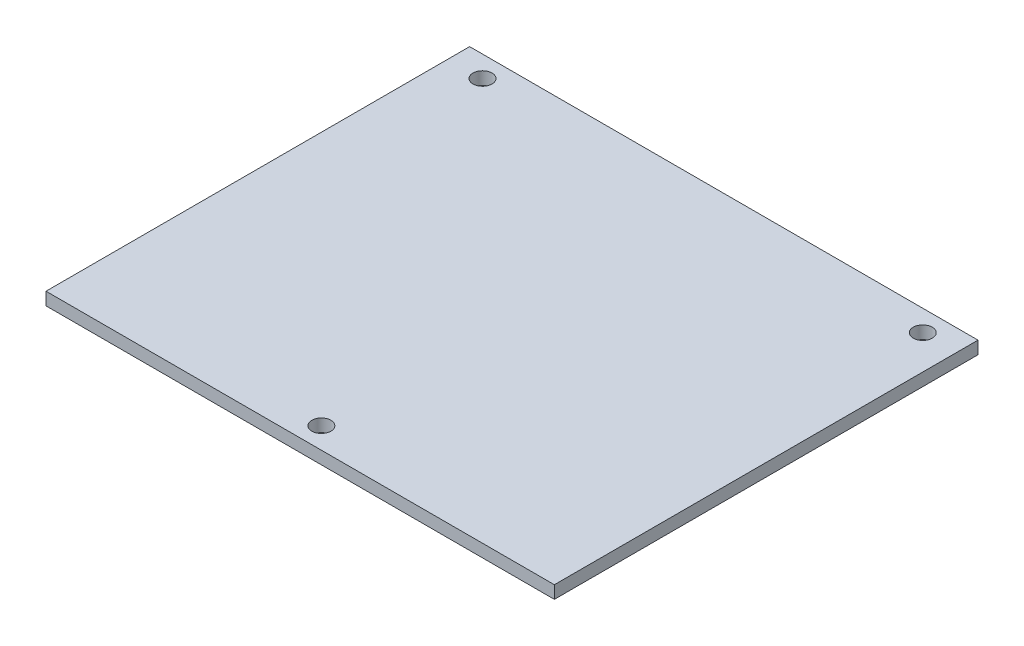
ISO-10303-21;
HEADER;
FILE_DESCRIPTION(('STEP AP214'),'2;1');
FILE_NAME('part.step','',(''),(''),'','','');
FILE_SCHEMA(('AUTOMOTIVE_DESIGN { 1 0 10303 214 1 1 1 1 }'));
ENDSEC;
DATA;
#1=APPLICATION_CONTEXT('core data for automotive mechanical design processes');
#2=APPLICATION_PROTOCOL_DEFINITION('international standard','automotive_design',2000,#1);
#3=PRODUCT_CONTEXT('',#1,'mechanical');
#4=PRODUCT('Part','Part','',(#3));
#5=PRODUCT_RELATED_PRODUCT_CATEGORY('part','',(#4));
#6=PRODUCT_DEFINITION_FORMATION('','',#4);
#7=PRODUCT_DEFINITION_CONTEXT('part definition',#1,'design');
#8=PRODUCT_DEFINITION('design','',#6,#7);
#9=PRODUCT_DEFINITION_SHAPE('','',#8);
#10=(LENGTH_UNIT() NAMED_UNIT(*) SI_UNIT(.MILLI.,.METRE.));
#11=(NAMED_UNIT(*) PLANE_ANGLE_UNIT() SI_UNIT($,.RADIAN.));
#12=(NAMED_UNIT(*) SI_UNIT($,.STERADIAN.) SOLID_ANGLE_UNIT());
#13=UNCERTAINTY_MEASURE_WITH_UNIT(LENGTH_MEASURE(1.E-05),#10,'distance_accuracy_value','');
#14=(GEOMETRIC_REPRESENTATION_CONTEXT(3) GLOBAL_UNCERTAINTY_ASSIGNED_CONTEXT((#13)) GLOBAL_UNIT_ASSIGNED_CONTEXT((#10,
#11,#12)) REPRESENTATION_CONTEXT('',''));
#15=CARTESIAN_POINT('',(0.,0.,0.));
#16=DIRECTION('',(0.,0.,1.));
#17=DIRECTION('',(1.,0.,0.));
#18=AXIS2_PLACEMENT_3D('',#15,#16,#17);
#19=CARTESIAN_POINT('',(0.,3.,0.));
#20=DIRECTION('',(1.,0.,0.));
#21=DIRECTION('',(0.,0.,-1.));
#22=AXIS2_PLACEMENT_3D('',#19,#20,#21);
#23=PLANE('',#22);
#24=DIRECTION('',(0.,0.,1.));
#25=VECTOR('',#24,1.);
#26=CARTESIAN_POINT('',(0.,0.,0.));
#27=LINE('',#26,#25);
#28=CARTESIAN_POINT('',(0.,0.,-100.));
#29=VERTEX_POINT('',#28);
#30=CARTESIAN_POINT('',(0.,0.,0.));
#31=VERTEX_POINT('',#30);
#32=EDGE_CURVE('E100',#29,#31,#27,.T.);
#33=ORIENTED_EDGE('',*,*,#32,.T.);
#34=DIRECTION('',(0.,-1.,0.));
#35=VECTOR('',#34,1.);
#36=CARTESIAN_POINT('',(0.,3.,0.));
#37=LINE('',#36,#35);
#38=CARTESIAN_POINT('',(0.,3.,0.));
#39=VERTEX_POINT('',#38);
#40=EDGE_CURVE('E11',#39,#31,#37,.T.);
#41=ORIENTED_EDGE('',*,*,#40,.F.);
#42=DIRECTION('',(0.,0.,1.));
#43=VECTOR('',#42,1.);
#44=CARTESIAN_POINT('',(0.,3.,0.));
#45=LINE('',#44,#43);
#46=CARTESIAN_POINT('',(0.,3.,-100.));
#47=VERTEX_POINT('',#46);
#48=EDGE_CURVE('E87',#47,#39,#45,.T.);
#49=ORIENTED_EDGE('',*,*,#48,.F.);
#50=DIRECTION('',(0.,-1.,0.));
#51=VECTOR('',#50,1.);
#52=CARTESIAN_POINT('',(0.,3.,-100.));
#53=LINE('',#52,#51);
#54=EDGE_CURVE('E96',#47,#29,#53,.T.);
#55=ORIENTED_EDGE('',*,*,#54,.T.);
#56=EDGE_LOOP('',(#33,#41,#49,#55));
#57=FACE_BOUND('',#56,.T.);
#58=ADVANCED_FACE('F34',(#57),#23,.F.);
#59=CARTESIAN_POINT('',(0.,3.,0.));
#60=DIRECTION('',(0.,0.,-1.));
#61=DIRECTION('',(-1.,0.,0.));
#62=AXIS2_PLACEMENT_3D('',#59,#60,#61);
#63=PLANE('',#62);
#64=DIRECTION('',(1.,0.,0.));
#65=VECTOR('',#64,1.);
#66=CARTESIAN_POINT('',(0.,0.,0.));
#67=LINE('',#66,#65);
#68=CARTESIAN_POINT('',(120.,0.,0.));
#69=VERTEX_POINT('',#68);
#70=EDGE_CURVE('E91',#31,#69,#67,.T.);
#71=ORIENTED_EDGE('',*,*,#70,.T.);
#72=DIRECTION('',(0.,-1.,0.));
#73=VECTOR('',#72,1.);
#74=CARTESIAN_POINT('',(120.,3.,0.));
#75=LINE('',#74,#73);
#76=CARTESIAN_POINT('',(120.,3.,0.));
#77=VERTEX_POINT('',#76);
#78=EDGE_CURVE('E43',#77,#69,#75,.T.);
#79=ORIENTED_EDGE('',*,*,#78,.F.);
#80=DIRECTION('',(1.,0.,0.));
#81=VECTOR('',#80,1.);
#82=CARTESIAN_POINT('',(0.,3.,0.));
#83=LINE('',#82,#81);
#84=EDGE_CURVE('E82',#39,#77,#83,.T.);
#85=ORIENTED_EDGE('',*,*,#84,.F.);
#86=ORIENTED_EDGE('',*,*,#40,.T.);
#87=EDGE_LOOP('',(#71,#79,#85,#86));
#88=FACE_BOUND('',#87,.T.);
#89=ADVANCED_FACE('F90',(#88),#63,.F.);
#90=CARTESIAN_POINT('',(120.,3.,0.));
#91=DIRECTION('',(-1.,0.,0.));
#92=DIRECTION('',(0.,0.,1.));
#93=AXIS2_PLACEMENT_3D('',#90,#91,#92);
#94=PLANE('',#93);
#95=DIRECTION('',(0.,0.,-1.));
#96=VECTOR('',#95,1.);
#97=CARTESIAN_POINT('',(120.,0.,0.));
#98=LINE('',#97,#96);
#99=CARTESIAN_POINT('',(120.,0.,-100.));
#100=VERTEX_POINT('',#99);
#101=EDGE_CURVE('E69',#69,#100,#98,.T.);
#102=ORIENTED_EDGE('',*,*,#101,.T.);
#103=DIRECTION('',(0.,-1.,0.));
#104=VECTOR('',#103,1.);
#105=CARTESIAN_POINT('',(120.,3.,-100.));
#106=LINE('',#105,#104);
#107=CARTESIAN_POINT('',(120.,3.,-100.));
#108=VERTEX_POINT('',#107);
#109=EDGE_CURVE('E92',#108,#100,#106,.T.);
#110=ORIENTED_EDGE('',*,*,#109,.F.);
#111=DIRECTION('',(0.,0.,-1.));
#112=VECTOR('',#111,1.);
#113=CARTESIAN_POINT('',(120.,3.,0.));
#114=LINE('',#113,#112);
#115=EDGE_CURVE('E85',#77,#108,#114,.T.);
#116=ORIENTED_EDGE('',*,*,#115,.F.);
#117=ORIENTED_EDGE('',*,*,#78,.T.);
#118=EDGE_LOOP('',(#102,#110,#116,#117));
#119=FACE_BOUND('',#118,.T.);
#120=ADVANCED_FACE('F94',(#119),#94,.F.);
#121=CARTESIAN_POINT('',(0.,3.,-100.));
#122=DIRECTION('',(0.,0.,1.));
#123=DIRECTION('',(1.,0.,0.));
#124=AXIS2_PLACEMENT_3D('',#121,#122,#123);
#125=PLANE('',#124);
#126=DIRECTION('',(-1.,0.,0.));
#127=VECTOR('',#126,1.);
#128=CARTESIAN_POINT('',(0.,0.,-100.));
#129=LINE('',#128,#127);
#130=EDGE_CURVE('E75',#100,#29,#129,.T.);
#131=ORIENTED_EDGE('',*,*,#130,.T.);
#132=ORIENTED_EDGE('',*,*,#54,.F.);
#133=DIRECTION('',(-1.,0.,0.));
#134=VECTOR('',#133,1.);
#135=CARTESIAN_POINT('',(0.,3.,-100.));
#136=LINE('',#135,#134);
#137=EDGE_CURVE('E52',#108,#47,#136,.T.);
#138=ORIENTED_EDGE('',*,*,#137,.F.);
#139=ORIENTED_EDGE('',*,*,#109,.T.);
#140=EDGE_LOOP('',(#131,#132,#138,#139));
#141=FACE_BOUND('',#140,.T.);
#142=ADVANCED_FACE('F133',(#141),#125,.F.);
#143=CARTESIAN_POINT('',(0.,3.,0.));
#144=DIRECTION('',(0.,-1.,0.));
#145=DIRECTION('',(0.,0.,-1.));
#146=AXIS2_PLACEMENT_3D('',#143,#144,#145);
#147=PLANE('',#146);
#148=CARTESIAN_POINT('',(8.03847577293368,3.,-95.));
#149=DIRECTION('',(0.,1.,0.));
#150=DIRECTION('',(0.,0.,1.));
#151=AXIS2_PLACEMENT_3D('',#148,#149,#150);
#152=CIRCLE('',#151,2.24999999999999);
#153=CARTESIAN_POINT('',(8.03847577293368,3.,-92.75));
#154=VERTEX_POINT('',#153);
#155=EDGE_CURVE('E123',#154,#154,#152,.T.);
#156=ORIENTED_EDGE('',*,*,#155,.F.);
#157=EDGE_LOOP('',(#156));
#158=FACE_BOUND('',#157,.T.);
#159=CARTESIAN_POINT('',(111.961524227066,3.,-95.));
#160=DIRECTION('',(0.,1.,0.));
#161=DIRECTION('',(0.,0.,1.));
#162=AXIS2_PLACEMENT_3D('',#159,#160,#161);
#163=CIRCLE('',#162,2.24999999999999);
#164=CARTESIAN_POINT('',(111.961524227066,3.,-92.75));
#165=VERTEX_POINT('',#164);
#166=EDGE_CURVE('E113',#165,#165,#163,.T.);
#167=ORIENTED_EDGE('',*,*,#166,.F.);
#168=EDGE_LOOP('',(#167));
#169=FACE_BOUND('',#168,.T.);
#170=CARTESIAN_POINT('',(60.,3.,-5.));
#171=DIRECTION('',(0.,1.,0.));
#172=DIRECTION('',(0.,0.,1.));
#173=AXIS2_PLACEMENT_3D('',#170,#171,#172);
#174=CIRCLE('',#173,2.24999999999999);
#175=CARTESIAN_POINT('',(60.,3.,-2.75000000000001));
#176=VERTEX_POINT('',#175);
#177=EDGE_CURVE('E110',#176,#176,#174,.T.);
#178=ORIENTED_EDGE('',*,*,#177,.F.);
#179=EDGE_LOOP('',(#178));
#180=FACE_BOUND('',#179,.T.);
#181=ORIENTED_EDGE('',*,*,#48,.T.);
#182=ORIENTED_EDGE('',*,*,#84,.T.);
#183=ORIENTED_EDGE('',*,*,#115,.T.);
#184=ORIENTED_EDGE('',*,*,#137,.T.);
#185=EDGE_LOOP('',(#181,#182,#183,#184));
#186=FACE_BOUND('',#185,.T.);
#187=ADVANCED_FACE('F83',(#158,#169,#180,#186),#147,.F.);
#188=CARTESIAN_POINT('',(0.,0.,0.));
#189=DIRECTION('',(0.,-1.,0.));
#190=DIRECTION('',(0.,0.,-1.));
#191=AXIS2_PLACEMENT_3D('',#188,#189,#190);
#192=PLANE('',#191);
#193=CARTESIAN_POINT('',(8.03847577293368,0.,-95.));
#194=DIRECTION('',(0.,-1.,0.));
#195=DIRECTION('',(0.,0.,-1.));
#196=AXIS2_PLACEMENT_3D('',#193,#194,#195);
#197=CIRCLE('',#196,2.24999999999999);
#198=CARTESIAN_POINT('',(8.03847577293368,0.,-97.25));
#199=VERTEX_POINT('',#198);
#200=EDGE_CURVE('E37',#199,#199,#197,.T.);
#201=ORIENTED_EDGE('',*,*,#200,.F.);
#202=EDGE_LOOP('',(#201));
#203=FACE_BOUND('',#202,.T.);
#204=CARTESIAN_POINT('',(111.961524227066,0.,-95.));
#205=DIRECTION('',(0.,-1.,0.));
#206=DIRECTION('',(0.,0.,-1.));
#207=AXIS2_PLACEMENT_3D('',#204,#205,#206);
#208=CIRCLE('',#207,2.24999999999999);
#209=CARTESIAN_POINT('',(111.961524227066,0.,-97.25));
#210=VERTEX_POINT('',#209);
#211=EDGE_CURVE('E111',#210,#210,#208,.T.);
#212=ORIENTED_EDGE('',*,*,#211,.F.);
#213=EDGE_LOOP('',(#212));
#214=FACE_BOUND('',#213,.T.);
#215=CARTESIAN_POINT('',(60.,0.,-5.));
#216=DIRECTION('',(0.,-1.,0.));
#217=DIRECTION('',(0.,0.,-1.));
#218=AXIS2_PLACEMENT_3D('',#215,#216,#217);
#219=CIRCLE('',#218,2.24999999999999);
#220=CARTESIAN_POINT('',(60.,0.,-7.24999999999999));
#221=VERTEX_POINT('',#220);
#222=EDGE_CURVE('E103',#221,#221,#219,.T.);
#223=ORIENTED_EDGE('',*,*,#222,.F.);
#224=EDGE_LOOP('',(#223));
#225=FACE_BOUND('',#224,.T.);
#226=ORIENTED_EDGE('',*,*,#32,.F.);
#227=ORIENTED_EDGE('',*,*,#130,.F.);
#228=ORIENTED_EDGE('',*,*,#101,.F.);
#229=ORIENTED_EDGE('',*,*,#70,.F.);
#230=EDGE_LOOP('',(#226,#227,#228,#229));
#231=FACE_BOUND('',#230,.T.);
#232=ADVANCED_FACE('F132',(#203,#214,#225,#231),#192,.T.);
#233=CARTESIAN_POINT('',(60.,3.,-5.));
#234=DIRECTION('',(0.,1.,0.));
#235=DIRECTION('',(0.,0.,1.));
#236=AXIS2_PLACEMENT_3D('',#233,#234,#235);
#237=CYLINDRICAL_SURFACE('',#236,2.24999999999999);
#238=ORIENTED_EDGE('',*,*,#222,.T.);
#239=EDGE_LOOP('',(#238));
#240=FACE_BOUND('',#239,.T.);
#241=ORIENTED_EDGE('',*,*,#177,.T.);
#242=EDGE_LOOP('',(#241));
#243=FACE_BOUND('',#242,.T.);
#244=ADVANCED_FACE('F138',(#240,#243),#237,.F.);
#245=CARTESIAN_POINT('',(111.961524227066,3.,-95.));
#246=DIRECTION('',(0.,1.,0.));
#247=DIRECTION('',(0.,0.,1.));
#248=AXIS2_PLACEMENT_3D('',#245,#246,#247);
#249=CYLINDRICAL_SURFACE('',#248,2.24999999999999);
#250=ORIENTED_EDGE('',*,*,#211,.T.);
#251=EDGE_LOOP('',(#250));
#252=FACE_BOUND('',#251,.T.);
#253=ORIENTED_EDGE('',*,*,#166,.T.);
#254=EDGE_LOOP('',(#253));
#255=FACE_BOUND('',#254,.T.);
#256=ADVANCED_FACE('F140',(#252,#255),#249,.F.);
#257=CARTESIAN_POINT('',(8.03847577293368,3.,-95.));
#258=DIRECTION('',(0.,1.,0.));
#259=DIRECTION('',(0.,0.,1.));
#260=AXIS2_PLACEMENT_3D('',#257,#258,#259);
#261=CYLINDRICAL_SURFACE('',#260,2.24999999999999);
#262=ORIENTED_EDGE('',*,*,#200,.T.);
#263=EDGE_LOOP('',(#262));
#264=FACE_BOUND('',#263,.T.);
#265=ORIENTED_EDGE('',*,*,#155,.T.);
#266=EDGE_LOOP('',(#265));
#267=FACE_BOUND('',#266,.T.);
#268=ADVANCED_FACE('F128',(#264,#267),#261,.F.);
#269=CLOSED_SHELL('',(#58,#89,#120,#142,#187,#232,#244,#256,#268));
#270=MANIFOLD_SOLID_BREP('B2',#269);
#271=ADVANCED_BREP_SHAPE_REPRESENTATION('',(#18,#270),#14);
#272=SHAPE_DEFINITION_REPRESENTATION(#9,#271);
ENDSEC;
END-ISO-10303-21;
